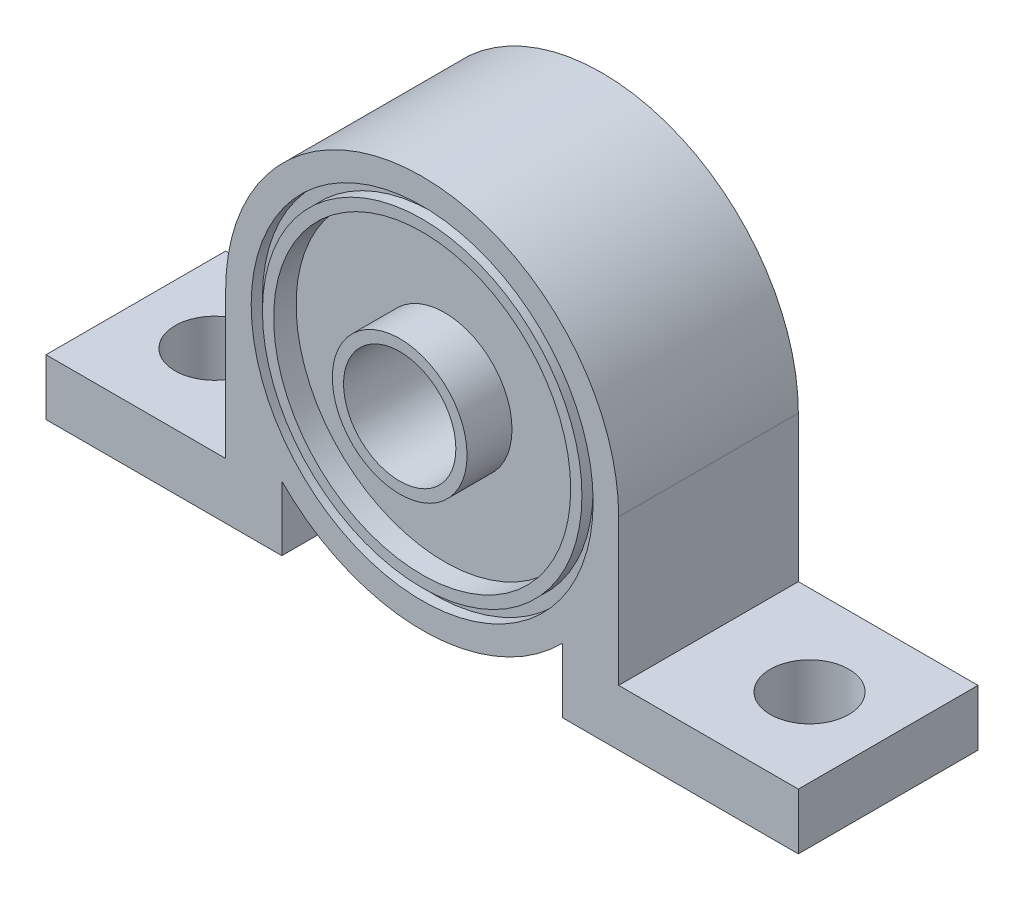
ISO-10303-21;
HEADER;
FILE_DESCRIPTION(('STEP AP214'),'2;1');
FILE_NAME('part.step','',(''),(''),'','','');
FILE_SCHEMA(('AUTOMOTIVE_DESIGN { 1 0 10303 214 1 1 1 1 }'));
ENDSEC;
DATA;
#1=APPLICATION_CONTEXT('core data for automotive mechanical design processes');
#2=APPLICATION_PROTOCOL_DEFINITION('international standard','automotive_design',2000,#1);
#3=PRODUCT_CONTEXT('',#1,'mechanical');
#4=PRODUCT('Part','Part','',(#3));
#5=PRODUCT_RELATED_PRODUCT_CATEGORY('part','',(#4));
#6=PRODUCT_DEFINITION_FORMATION('','',#4);
#7=PRODUCT_DEFINITION_CONTEXT('part definition',#1,'design');
#8=PRODUCT_DEFINITION('design','',#6,#7);
#9=PRODUCT_DEFINITION_SHAPE('','',#8);
#10=(LENGTH_UNIT() NAMED_UNIT(*) SI_UNIT(.MILLI.,.METRE.));
#11=(NAMED_UNIT(*) PLANE_ANGLE_UNIT() SI_UNIT($,.RADIAN.));
#12=(NAMED_UNIT(*) SI_UNIT($,.STERADIAN.) SOLID_ANGLE_UNIT());
#13=UNCERTAINTY_MEASURE_WITH_UNIT(LENGTH_MEASURE(1.E-05),#10,'distance_accuracy_value','');
#14=(GEOMETRIC_REPRESENTATION_CONTEXT(3) GLOBAL_UNCERTAINTY_ASSIGNED_CONTEXT((#13)) GLOBAL_UNIT_ASSIGNED_CONTEXT((#10,
#11,#12)) REPRESENTATION_CONTEXT('',''));
#15=CARTESIAN_POINT('',(0.,0.,0.));
#16=DIRECTION('',(0.,0.,1.));
#17=DIRECTION('',(1.,0.,0.));
#18=AXIS2_PLACEMENT_3D('',#15,#16,#17);
#19=CARTESIAN_POINT('',(0.,0.,16.));
#20=DIRECTION('',(0.,0.,1.));
#21=DIRECTION('',(1.,0.,0.));
#22=AXIS2_PLACEMENT_3D('',#19,#20,#21);
#23=PLANE('',#22);
#24=CARTESIAN_POINT('',(0.,0.,16.));
#25=DIRECTION('',(0.,0.,1.));
#26=DIRECTION('',(1.,0.,0.));
#27=AXIS2_PLACEMENT_3D('',#24,#25,#26);
#28=CIRCLE('',#27,13.2270891764255);
#29=CARTESIAN_POINT('',(13.2270891764255,0.,16.));
#30=VERTEX_POINT('',#29);
#31=EDGE_CURVE('E308',#30,#30,#28,.T.);
#32=ORIENTED_EDGE('',*,*,#31,.F.);
#33=EDGE_LOOP('',(#32));
#34=FACE_BOUND('',#33,.T.);
#35=CARTESIAN_POINT('',(0.,0.,16.));
#36=DIRECTION('',(0.,0.,1.));
#37=DIRECTION('',(1.,0.,0.));
#38=AXIS2_PLACEMENT_3D('',#35,#36,#37);
#39=CIRCLE('',#38,14.2270891764255);
#40=CARTESIAN_POINT('',(14.2270891764255,0.,16.));
#41=VERTEX_POINT('',#40);
#42=EDGE_CURVE('E290',#41,#41,#39,.T.);
#43=ORIENTED_EDGE('',*,*,#42,.T.);
#44=EDGE_LOOP('',(#43));
#45=FACE_BOUND('',#44,.T.);
#46=ADVANCED_FACE('F37',(#34,#45),#23,.T.);
#47=CARTESIAN_POINT('',(0.,0.,0.));
#48=DIRECTION('',(0.,0.,1.));
#49=DIRECTION('',(1.,0.,0.));
#50=AXIS2_PLACEMENT_3D('',#47,#48,#49);
#51=PLANE('',#50);
#52=CARTESIAN_POINT('',(0.,0.,0.));
#53=DIRECTION('',(0.,0.,1.));
#54=DIRECTION('',(1.,0.,0.));
#55=AXIS2_PLACEMENT_3D('',#52,#53,#54);
#56=CIRCLE('',#55,5.);
#57=CARTESIAN_POINT('',(5.,0.,0.));
#58=VERTEX_POINT('',#57);
#59=EDGE_CURVE('E163',#58,#58,#56,.T.);
#60=ORIENTED_EDGE('',*,*,#59,.T.);
#61=EDGE_LOOP('',(#60));
#62=FACE_BOUND('',#61,.T.);
#63=CARTESIAN_POINT('',(0.,0.,0.));
#64=DIRECTION('',(0.,0.,-1.));
#65=DIRECTION('',(-1.,0.,0.));
#66=AXIS2_PLACEMENT_3D('',#63,#64,#65);
#67=CIRCLE('',#66,6.);
#68=CARTESIAN_POINT('',(-6.,0.,0.));
#69=VERTEX_POINT('',#68);
#70=EDGE_CURVE('E287',#69,#69,#67,.T.);
#71=ORIENTED_EDGE('',*,*,#70,.T.);
#72=EDGE_LOOP('',(#71));
#73=FACE_BOUND('',#72,.T.);
#74=ADVANCED_FACE('F264',(#62,#73),#51,.F.);
#75=CARTESIAN_POINT('',(0.,0.,16.));
#76=DIRECTION('',(0.,0.,1.));
#77=DIRECTION('',(1.,0.,0.));
#78=AXIS2_PLACEMENT_3D('',#75,#76,#77);
#79=CIRCLE('',#78,15.2270891764255);
#80=CARTESIAN_POINT('',(15.2270891764255,0.,16.));
#81=VERTEX_POINT('',#80);
#82=EDGE_CURVE('E281',#81,#81,#79,.T.);
#83=ORIENTED_EDGE('',*,*,#82,.F.);
#84=EDGE_LOOP('',(#83));
#85=FACE_BOUND('',#84,.T.);
#86=DIRECTION('',(1.,0.,0.));
#87=VECTOR('',#86,1.);
#88=CARTESIAN_POINT('',(12.5,-18.,16.));
#89=LINE('',#88,#87);
#90=CARTESIAN_POINT('',(12.5,-18.,16.));
#91=VERTEX_POINT('',#90);
#92=CARTESIAN_POINT('',(33.5,-18.,16.));
#93=VERTEX_POINT('',#92);
#94=EDGE_CURVE('E182',#91,#93,#89,.T.);
#95=ORIENTED_EDGE('',*,*,#94,.T.);
#96=DIRECTION('',(0.,1.,0.));
#97=VECTOR('',#96,1.);
#98=CARTESIAN_POINT('',(33.5,-18.,16.));
#99=LINE('',#98,#97);
#100=CARTESIAN_POINT('',(33.5,-13.,16.));
#101=VERTEX_POINT('',#100);
#102=EDGE_CURVE('E110',#93,#101,#99,.T.);
#103=ORIENTED_EDGE('',*,*,#102,.T.);
#104=DIRECTION('',(-1.,0.,0.));
#105=VECTOR('',#104,1.);
#106=CARTESIAN_POINT('',(33.5,-13.,16.));
#107=LINE('',#106,#105);
#108=CARTESIAN_POINT('',(17.5,-13.,16.));
#109=VERTEX_POINT('',#108);
#110=EDGE_CURVE('E210',#101,#109,#107,.T.);
#111=ORIENTED_EDGE('',*,*,#110,.T.);
#112=DIRECTION('',(0.,1.,0.));
#113=VECTOR('',#112,1.);
#114=CARTESIAN_POINT('',(17.5,-13.,16.));
#115=LINE('',#114,#113);
#116=CARTESIAN_POINT('',(17.5,0.,16.));
#117=VERTEX_POINT('',#116);
#118=EDGE_CURVE('E228',#109,#117,#115,.T.);
#119=ORIENTED_EDGE('',*,*,#118,.T.);
#120=CARTESIAN_POINT('',(0.,0.,16.));
#121=DIRECTION('',(0.,0.,1.));
#122=DIRECTION('',(1.,0.,0.));
#123=AXIS2_PLACEMENT_3D('',#120,#121,#122);
#124=CIRCLE('',#123,17.5);
#125=CARTESIAN_POINT('',(-17.5,0.,16.));
#126=VERTEX_POINT('',#125);
#127=EDGE_CURVE('E225',#117,#126,#124,.T.);
#128=ORIENTED_EDGE('',*,*,#127,.T.);
#129=DIRECTION('',(0.,-1.,0.));
#130=VECTOR('',#129,1.);
#131=CARTESIAN_POINT('',(-17.5,-13.,16.));
#132=LINE('',#131,#130);
#133=CARTESIAN_POINT('',(-17.5,-13.,16.));
#134=VERTEX_POINT('',#133);
#135=EDGE_CURVE('E227',#126,#134,#132,.T.);
#136=ORIENTED_EDGE('',*,*,#135,.T.);
#137=DIRECTION('',(-1.,0.,0.));
#138=VECTOR('',#137,1.);
#139=CARTESIAN_POINT('',(-33.5,-13.,16.));
#140=LINE('',#139,#138);
#141=CARTESIAN_POINT('',(-33.5,-13.,16.));
#142=VERTEX_POINT('',#141);
#143=EDGE_CURVE('E230',#134,#142,#140,.T.);
#144=ORIENTED_EDGE('',*,*,#143,.T.);
#145=DIRECTION('',(0.,-1.,0.));
#146=VECTOR('',#145,1.);
#147=CARTESIAN_POINT('',(-33.5,-18.,16.));
#148=LINE('',#147,#146);
#149=CARTESIAN_POINT('',(-33.5,-18.,16.));
#150=VERTEX_POINT('',#149);
#151=EDGE_CURVE('E236',#142,#150,#148,.T.);
#152=ORIENTED_EDGE('',*,*,#151,.T.);
#153=DIRECTION('',(1.,0.,0.));
#154=VECTOR('',#153,1.);
#155=CARTESIAN_POINT('',(-12.5,-18.,16.));
#156=LINE('',#155,#154);
#157=CARTESIAN_POINT('',(-12.5,-18.,16.));
#158=VERTEX_POINT('',#157);
#159=EDGE_CURVE('E141',#150,#158,#156,.T.);
#160=ORIENTED_EDGE('',*,*,#159,.T.);
#161=DIRECTION('',(0.,1.,0.));
#162=VECTOR('',#161,1.);
#163=CARTESIAN_POINT('',(-12.5,-18.,16.));
#164=LINE('',#163,#162);
#165=CARTESIAN_POINT('',(-12.5,-12.2474487139159,16.));
#166=VERTEX_POINT('',#165);
#167=EDGE_CURVE('E135',#158,#166,#164,.T.);
#168=ORIENTED_EDGE('',*,*,#167,.T.);
#169=CARTESIAN_POINT('',(0.,0.,16.));
#170=DIRECTION('',(0.,0.,1.));
#171=DIRECTION('',(1.,0.,0.));
#172=AXIS2_PLACEMENT_3D('',#169,#170,#171);
#173=CIRCLE('',#172,17.5);
#174=CARTESIAN_POINT('',(12.5,-12.2474487139159,16.));
#175=VERTEX_POINT('',#174);
#176=EDGE_CURVE('E139',#166,#175,#173,.T.);
#177=ORIENTED_EDGE('',*,*,#176,.T.);
#178=DIRECTION('',(0.,-1.,0.));
#179=VECTOR('',#178,1.);
#180=CARTESIAN_POINT('',(12.5,-18.,16.));
#181=LINE('',#180,#179);
#182=EDGE_CURVE('E55',#175,#91,#181,.T.);
#183=ORIENTED_EDGE('',*,*,#182,.T.);
#184=EDGE_LOOP('',(#95,#103,#111,#119,#128,#136,#144,#152,#160,#168,#177,#183));
#185=FACE_BOUND('',#184,.T.);
#186=ADVANCED_FACE('F137',(#85,#185),#23,.T.);
#187=CARTESIAN_POINT('',(0.,0.,0.));
#188=DIRECTION('',(0.,0.,-1.));
#189=DIRECTION('',(-1.,0.,0.));
#190=AXIS2_PLACEMENT_3D('',#187,#188,#189);
#191=CIRCLE('',#190,13.402399482386);
#192=CARTESIAN_POINT('',(-13.402399482386,0.,0.));
#193=VERTEX_POINT('',#192);
#194=EDGE_CURVE('E297',#193,#193,#191,.T.);
#195=ORIENTED_EDGE('',*,*,#194,.F.);
#196=EDGE_LOOP('',(#195));
#197=FACE_BOUND('',#196,.T.);
#198=DIRECTION('',(1.,0.,0.));
#199=VECTOR('',#198,1.);
#200=CARTESIAN_POINT('',(12.5,-18.,0.));
#201=LINE('',#200,#199);
#202=CARTESIAN_POINT('',(12.5,-18.,0.));
#203=VERTEX_POINT('',#202);
#204=CARTESIAN_POINT('',(33.5,-18.,0.));
#205=VERTEX_POINT('',#204);
#206=EDGE_CURVE('E159',#203,#205,#201,.T.);
#207=ORIENTED_EDGE('',*,*,#206,.F.);
#208=DIRECTION('',(0.,-1.,0.));
#209=VECTOR('',#208,1.);
#210=CARTESIAN_POINT('',(12.5,-18.,0.));
#211=LINE('',#210,#209);
#212=CARTESIAN_POINT('',(12.5,-12.2474487139159,0.));
#213=VERTEX_POINT('',#212);
#214=EDGE_CURVE('E102',#213,#203,#211,.T.);
#215=ORIENTED_EDGE('',*,*,#214,.F.);
#216=CARTESIAN_POINT('',(0.,0.,0.));
#217=DIRECTION('',(0.,0.,1.));
#218=DIRECTION('',(1.,0.,0.));
#219=AXIS2_PLACEMENT_3D('',#216,#217,#218);
#220=CIRCLE('',#219,17.5);
#221=CARTESIAN_POINT('',(-12.5,-12.2474487139159,0.));
#222=VERTEX_POINT('',#221);
#223=EDGE_CURVE('E96',#222,#213,#220,.T.);
#224=ORIENTED_EDGE('',*,*,#223,.F.);
#225=DIRECTION('',(0.,1.,0.));
#226=VECTOR('',#225,1.);
#227=CARTESIAN_POINT('',(-12.5,-18.,0.));
#228=LINE('',#227,#226);
#229=CARTESIAN_POINT('',(-12.5,-18.,0.));
#230=VERTEX_POINT('',#229);
#231=EDGE_CURVE('E149',#230,#222,#228,.T.);
#232=ORIENTED_EDGE('',*,*,#231,.F.);
#233=DIRECTION('',(1.,0.,0.));
#234=VECTOR('',#233,1.);
#235=CARTESIAN_POINT('',(-12.5,-18.,0.));
#236=LINE('',#235,#234);
#237=CARTESIAN_POINT('',(-33.5,-18.,0.));
#238=VERTEX_POINT('',#237);
#239=EDGE_CURVE('E177',#238,#230,#236,.T.);
#240=ORIENTED_EDGE('',*,*,#239,.F.);
#241=DIRECTION('',(0.,-1.,0.));
#242=VECTOR('',#241,1.);
#243=CARTESIAN_POINT('',(-33.5,-18.,0.));
#244=LINE('',#243,#242);
#245=CARTESIAN_POINT('',(-33.5,-13.,0.));
#246=VERTEX_POINT('',#245);
#247=EDGE_CURVE('E175',#246,#238,#244,.T.);
#248=ORIENTED_EDGE('',*,*,#247,.F.);
#249=DIRECTION('',(-1.,0.,0.));
#250=VECTOR('',#249,1.);
#251=CARTESIAN_POINT('',(-33.5,-13.,0.));
#252=LINE('',#251,#250);
#253=CARTESIAN_POINT('',(-17.5,-13.,0.));
#254=VERTEX_POINT('',#253);
#255=EDGE_CURVE('E173',#254,#246,#252,.T.);
#256=ORIENTED_EDGE('',*,*,#255,.F.);
#257=DIRECTION('',(0.,-1.,0.));
#258=VECTOR('',#257,1.);
#259=CARTESIAN_POINT('',(-17.5,-13.,0.));
#260=LINE('',#259,#258);
#261=CARTESIAN_POINT('',(-17.5,0.,0.));
#262=VERTEX_POINT('',#261);
#263=EDGE_CURVE('E171',#262,#254,#260,.T.);
#264=ORIENTED_EDGE('',*,*,#263,.F.);
#265=CARTESIAN_POINT('',(0.,0.,0.));
#266=DIRECTION('',(0.,0.,1.));
#267=DIRECTION('',(1.,0.,0.));
#268=AXIS2_PLACEMENT_3D('',#265,#266,#267);
#269=CIRCLE('',#268,17.5);
#270=CARTESIAN_POINT('',(17.5,0.,0.));
#271=VERTEX_POINT('',#270);
#272=EDGE_CURVE('E169',#271,#262,#269,.T.);
#273=ORIENTED_EDGE('',*,*,#272,.F.);
#274=DIRECTION('',(0.,1.,0.));
#275=VECTOR('',#274,1.);
#276=CARTESIAN_POINT('',(17.5,-13.,0.));
#277=LINE('',#276,#275);
#278=CARTESIAN_POINT('',(17.5,-13.,0.));
#279=VERTEX_POINT('',#278);
#280=EDGE_CURVE('E167',#279,#271,#277,.T.);
#281=ORIENTED_EDGE('',*,*,#280,.F.);
#282=DIRECTION('',(-1.,0.,0.));
#283=VECTOR('',#282,1.);
#284=CARTESIAN_POINT('',(33.5,-13.,0.));
#285=LINE('',#284,#283);
#286=CARTESIAN_POINT('',(33.5,-13.,0.));
#287=VERTEX_POINT('',#286);
#288=EDGE_CURVE('E165',#287,#279,#285,.T.);
#289=ORIENTED_EDGE('',*,*,#288,.F.);
#290=DIRECTION('',(0.,1.,0.));
#291=VECTOR('',#290,1.);
#292=CARTESIAN_POINT('',(33.5,-18.,0.));
#293=LINE('',#292,#291);
#294=EDGE_CURVE('E162',#205,#287,#293,.T.);
#295=ORIENTED_EDGE('',*,*,#294,.F.);
#296=EDGE_LOOP('',(#207,#215,#224,#232,#240,#248,#256,#264,#273,#281,#289,#295));
#297=FACE_BOUND('',#296,.T.);
#298=ADVANCED_FACE('F214',(#197,#297),#51,.F.);
#299=CARTESIAN_POINT('',(12.5,-18.,16.));
#300=DIRECTION('',(0.,1.,0.));
#301=DIRECTION('',(-1.,0.,0.));
#302=AXIS2_PLACEMENT_3D('',#299,#300,#301);
#303=PLANE('',#302);
#304=CARTESIAN_POINT('',(26.5,-18.,8.));
#305=DIRECTION('',(0.,-1.,0.));
#306=DIRECTION('',(1.,0.,0.));
#307=AXIS2_PLACEMENT_3D('',#304,#305,#306);
#308=CIRCLE('',#307,3.5);
#309=CARTESIAN_POINT('',(30.,-18.,8.));
#310=VERTEX_POINT('',#309);
#311=EDGE_CURVE('E382',#310,#310,#308,.T.);
#312=ORIENTED_EDGE('',*,*,#311,.F.);
#313=EDGE_LOOP('',(#312));
#314=FACE_BOUND('',#313,.T.);
#315=ORIENTED_EDGE('',*,*,#206,.T.);
#316=DIRECTION('',(0.,0.,-1.));
#317=VECTOR('',#316,1.);
#318=CARTESIAN_POINT('',(33.5,-18.,16.));
#319=LINE('',#318,#317);
#320=EDGE_CURVE('E11',#93,#205,#319,.T.);
#321=ORIENTED_EDGE('',*,*,#320,.F.);
#322=ORIENTED_EDGE('',*,*,#94,.F.);
#323=DIRECTION('',(0.,0.,-1.));
#324=VECTOR('',#323,1.);
#325=CARTESIAN_POINT('',(12.5,-18.,16.));
#326=LINE('',#325,#324);
#327=EDGE_CURVE('E155',#91,#203,#326,.T.);
#328=ORIENTED_EDGE('',*,*,#327,.T.);
#329=EDGE_LOOP('',(#315,#321,#322,#328));
#330=FACE_BOUND('',#329,.T.);
#331=ADVANCED_FACE('F39',(#314,#330),#303,.F.);
#332=CARTESIAN_POINT('',(33.5,-18.,16.));
#333=DIRECTION('',(-1.,0.,0.));
#334=DIRECTION('',(0.,-1.,0.));
#335=AXIS2_PLACEMENT_3D('',#332,#333,#334);
#336=PLANE('',#335);
#337=ORIENTED_EDGE('',*,*,#294,.T.);
#338=DIRECTION('',(0.,0.,-1.));
#339=VECTOR('',#338,1.);
#340=CARTESIAN_POINT('',(33.5,-13.,16.));
#341=LINE('',#340,#339);
#342=EDGE_CURVE('E47',#101,#287,#341,.T.);
#343=ORIENTED_EDGE('',*,*,#342,.F.);
#344=ORIENTED_EDGE('',*,*,#102,.F.);
#345=ORIENTED_EDGE('',*,*,#320,.T.);
#346=EDGE_LOOP('',(#337,#343,#344,#345));
#347=FACE_BOUND('',#346,.T.);
#348=ADVANCED_FACE('F421',(#347),#336,.F.);
#349=CARTESIAN_POINT('',(33.5,-13.,16.));
#350=DIRECTION('',(0.,-1.,0.));
#351=DIRECTION('',(1.,0.,0.));
#352=AXIS2_PLACEMENT_3D('',#349,#350,#351);
#353=PLANE('',#352);
#354=CARTESIAN_POINT('',(26.5,-13.,8.));
#355=DIRECTION('',(0.,-1.,0.));
#356=DIRECTION('',(1.,0.,0.));
#357=AXIS2_PLACEMENT_3D('',#354,#355,#356);
#358=CIRCLE('',#357,3.5);
#359=CARTESIAN_POINT('',(30.,-13.,8.));
#360=VERTEX_POINT('',#359);
#361=EDGE_CURVE('E41',#360,#360,#358,.T.);
#362=ORIENTED_EDGE('',*,*,#361,.T.);
#363=EDGE_LOOP('',(#362));
#364=FACE_BOUND('',#363,.T.);
#365=ORIENTED_EDGE('',*,*,#288,.T.);
#366=DIRECTION('',(0.,0.,-1.));
#367=VECTOR('',#366,1.);
#368=CARTESIAN_POINT('',(17.5,-13.,16.));
#369=LINE('',#368,#367);
#370=EDGE_CURVE('E201',#109,#279,#369,.T.);
#371=ORIENTED_EDGE('',*,*,#370,.F.);
#372=ORIENTED_EDGE('',*,*,#110,.F.);
#373=ORIENTED_EDGE('',*,*,#342,.T.);
#374=EDGE_LOOP('',(#365,#371,#372,#373));
#375=FACE_BOUND('',#374,.T.);
#376=ADVANCED_FACE('F208',(#364,#375),#353,.F.);
#377=CARTESIAN_POINT('',(17.5,-13.,16.));
#378=DIRECTION('',(-1.,0.,0.));
#379=DIRECTION('',(0.,0.,1.));
#380=AXIS2_PLACEMENT_3D('',#377,#378,#379);
#381=PLANE('',#380);
#382=ORIENTED_EDGE('',*,*,#280,.T.);
#383=DIRECTION('',(0.,0.,-1.));
#384=VECTOR('',#383,1.);
#385=CARTESIAN_POINT('',(17.5,0.,16.));
#386=LINE('',#385,#384);
#387=EDGE_CURVE('E198',#117,#271,#386,.T.);
#388=ORIENTED_EDGE('',*,*,#387,.F.);
#389=ORIENTED_EDGE('',*,*,#118,.F.);
#390=ORIENTED_EDGE('',*,*,#370,.T.);
#391=EDGE_LOOP('',(#382,#388,#389,#390));
#392=FACE_BOUND('',#391,.T.);
#393=ADVANCED_FACE('F219',(#392),#381,.F.);
#394=CARTESIAN_POINT('',(0.,0.,16.));
#395=DIRECTION('',(0.,0.,-1.));
#396=DIRECTION('',(-1.,0.,0.));
#397=AXIS2_PLACEMENT_3D('',#394,#395,#396);
#398=CYLINDRICAL_SURFACE('',#397,17.5);
#399=ORIENTED_EDGE('',*,*,#272,.T.);
#400=DIRECTION('',(0.,0.,-1.));
#401=VECTOR('',#400,1.);
#402=CARTESIAN_POINT('',(-17.5,0.,16.));
#403=LINE('',#402,#401);
#404=EDGE_CURVE('E195',#126,#262,#403,.T.);
#405=ORIENTED_EDGE('',*,*,#404,.F.);
#406=ORIENTED_EDGE('',*,*,#127,.F.);
#407=ORIENTED_EDGE('',*,*,#387,.T.);
#408=EDGE_LOOP('',(#399,#405,#406,#407));
#409=FACE_BOUND('',#408,.T.);
#410=ADVANCED_FACE('F223',(#409),#398,.T.);
#411=CARTESIAN_POINT('',(-17.5,-13.,16.));
#412=DIRECTION('',(1.,0.,0.));
#413=DIRECTION('',(0.,0.,-1.));
#414=AXIS2_PLACEMENT_3D('',#411,#412,#413);
#415=PLANE('',#414);
#416=ORIENTED_EDGE('',*,*,#263,.T.);
#417=DIRECTION('',(0.,0.,-1.));
#418=VECTOR('',#417,1.);
#419=CARTESIAN_POINT('',(-17.5,-13.,16.));
#420=LINE('',#419,#418);
#421=EDGE_CURVE('E192',#134,#254,#420,.T.);
#422=ORIENTED_EDGE('',*,*,#421,.F.);
#423=ORIENTED_EDGE('',*,*,#135,.F.);
#424=ORIENTED_EDGE('',*,*,#404,.T.);
#425=EDGE_LOOP('',(#416,#422,#423,#424));
#426=FACE_BOUND('',#425,.T.);
#427=ADVANCED_FACE('F412',(#426),#415,.F.);
#428=CARTESIAN_POINT('',(-33.5,-13.,16.));
#429=DIRECTION('',(0.,-1.,0.));
#430=DIRECTION('',(0.,0.,-1.));
#431=AXIS2_PLACEMENT_3D('',#428,#429,#430);
#432=PLANE('',#431);
#433=CARTESIAN_POINT('',(-26.5,-13.,7.99999999999999));
#434=DIRECTION('',(0.,-1.,0.));
#435=DIRECTION('',(0.,0.,-1.));
#436=AXIS2_PLACEMENT_3D('',#433,#434,#435);
#437=CIRCLE('',#436,3.5);
#438=CARTESIAN_POINT('',(-26.5,-13.,4.49999999999999));
#439=VERTEX_POINT('',#438);
#440=EDGE_CURVE('E386',#439,#439,#437,.T.);
#441=ORIENTED_EDGE('',*,*,#440,.T.);
#442=EDGE_LOOP('',(#441));
#443=FACE_BOUND('',#442,.T.);
#444=ORIENTED_EDGE('',*,*,#255,.T.);
#445=DIRECTION('',(0.,0.,-1.));
#446=VECTOR('',#445,1.);
#447=CARTESIAN_POINT('',(-33.5,-13.,16.));
#448=LINE('',#447,#446);
#449=EDGE_CURVE('E189',#142,#246,#448,.T.);
#450=ORIENTED_EDGE('',*,*,#449,.F.);
#451=ORIENTED_EDGE('',*,*,#143,.F.);
#452=ORIENTED_EDGE('',*,*,#421,.T.);
#453=EDGE_LOOP('',(#444,#450,#451,#452));
#454=FACE_BOUND('',#453,.T.);
#455=ADVANCED_FACE('F408',(#443,#454),#432,.F.);
#456=CARTESIAN_POINT('',(-33.5,-18.,16.));
#457=DIRECTION('',(1.,0.,0.));
#458=DIRECTION('',(0.,1.,0.));
#459=AXIS2_PLACEMENT_3D('',#456,#457,#458);
#460=PLANE('',#459);
#461=ORIENTED_EDGE('',*,*,#247,.T.);
#462=DIRECTION('',(0.,0.,-1.));
#463=VECTOR('',#462,1.);
#464=CARTESIAN_POINT('',(-33.5,-18.,16.));
#465=LINE('',#464,#463);
#466=EDGE_CURVE('E186',#150,#238,#465,.T.);
#467=ORIENTED_EDGE('',*,*,#466,.F.);
#468=ORIENTED_EDGE('',*,*,#151,.F.);
#469=ORIENTED_EDGE('',*,*,#449,.T.);
#470=EDGE_LOOP('',(#461,#467,#468,#469));
#471=FACE_BOUND('',#470,.T.);
#472=ADVANCED_FACE('F242',(#471),#460,.F.);
#473=CARTESIAN_POINT('',(-12.5,-18.,16.));
#474=DIRECTION('',(0.,1.,0.));
#475=DIRECTION('',(0.,0.,1.));
#476=AXIS2_PLACEMENT_3D('',#473,#474,#475);
#477=PLANE('',#476);
#478=CARTESIAN_POINT('',(-26.5,-18.,7.99999999999999));
#479=DIRECTION('',(0.,-1.,0.));
#480=DIRECTION('',(-1.,0.,0.));
#481=AXIS2_PLACEMENT_3D('',#478,#479,#480);
#482=CIRCLE('',#481,3.5);
#483=CARTESIAN_POINT('',(-30.,-18.,7.99999999999999));
#484=VERTEX_POINT('',#483);
#485=EDGE_CURVE('E392',#484,#484,#482,.T.);
#486=ORIENTED_EDGE('',*,*,#485,.F.);
#487=EDGE_LOOP('',(#486));
#488=FACE_BOUND('',#487,.T.);
#489=ORIENTED_EDGE('',*,*,#239,.T.);
#490=DIRECTION('',(0.,0.,-1.));
#491=VECTOR('',#490,1.);
#492=CARTESIAN_POINT('',(-12.5,-18.,16.));
#493=LINE('',#492,#491);
#494=EDGE_CURVE('E150',#158,#230,#493,.T.);
#495=ORIENTED_EDGE('',*,*,#494,.F.);
#496=ORIENTED_EDGE('',*,*,#159,.F.);
#497=ORIENTED_EDGE('',*,*,#466,.T.);
#498=EDGE_LOOP('',(#489,#495,#496,#497));
#499=FACE_BOUND('',#498,.T.);
#500=ADVANCED_FACE('F246',(#488,#499),#477,.F.);
#501=CARTESIAN_POINT('',(-12.5,-18.,16.));
#502=DIRECTION('',(-1.,0.,0.));
#503=DIRECTION('',(0.,0.,1.));
#504=AXIS2_PLACEMENT_3D('',#501,#502,#503);
#505=PLANE('',#504);
#506=ORIENTED_EDGE('',*,*,#231,.T.);
#507=DIRECTION('',(0.,0.,-1.));
#508=VECTOR('',#507,1.);
#509=CARTESIAN_POINT('',(-12.5,-12.2474487139159,16.));
#510=LINE('',#509,#508);
#511=EDGE_CURVE('E146',#166,#222,#510,.T.);
#512=ORIENTED_EDGE('',*,*,#511,.F.);
#513=ORIENTED_EDGE('',*,*,#167,.F.);
#514=ORIENTED_EDGE('',*,*,#494,.T.);
#515=EDGE_LOOP('',(#506,#512,#513,#514));
#516=FACE_BOUND('',#515,.T.);
#517=ADVANCED_FACE('F147',(#516),#505,.F.);
#518=CARTESIAN_POINT('',(0.,0.,16.));
#519=DIRECTION('',(0.,0.,-1.));
#520=DIRECTION('',(-1.,0.,0.));
#521=AXIS2_PLACEMENT_3D('',#518,#519,#520);
#522=CYLINDRICAL_SURFACE('',#521,17.5);
#523=ORIENTED_EDGE('',*,*,#223,.T.);
#524=DIRECTION('',(0.,0.,-1.));
#525=VECTOR('',#524,1.);
#526=CARTESIAN_POINT('',(12.5,-12.2474487139159,16.));
#527=LINE('',#526,#525);
#528=EDGE_CURVE('E151',#175,#213,#527,.T.);
#529=ORIENTED_EDGE('',*,*,#528,.F.);
#530=ORIENTED_EDGE('',*,*,#176,.F.);
#531=ORIENTED_EDGE('',*,*,#511,.T.);
#532=EDGE_LOOP('',(#523,#529,#530,#531));
#533=FACE_BOUND('',#532,.T.);
#534=ADVANCED_FACE('F153',(#533),#522,.T.);
#535=CARTESIAN_POINT('',(12.5,-18.,16.));
#536=DIRECTION('',(1.,0.,0.));
#537=DIRECTION('',(0.,1.,0.));
#538=AXIS2_PLACEMENT_3D('',#535,#536,#537);
#539=PLANE('',#538);
#540=ORIENTED_EDGE('',*,*,#214,.T.);
#541=ORIENTED_EDGE('',*,*,#327,.F.);
#542=ORIENTED_EDGE('',*,*,#182,.F.);
#543=ORIENTED_EDGE('',*,*,#528,.T.);
#544=EDGE_LOOP('',(#540,#541,#542,#543));
#545=FACE_BOUND('',#544,.T.);
#546=ADVANCED_FACE('F250',(#545),#539,.F.);
#547=CARTESIAN_POINT('',(0.,0.,16.));
#548=DIRECTION('',(0.,0.,-1.));
#549=DIRECTION('',(-1.,0.,0.));
#550=AXIS2_PLACEMENT_3D('',#547,#548,#549);
#551=CYLINDRICAL_SURFACE('',#550,5.);
#552=ORIENTED_EDGE('',*,*,#59,.F.);
#553=EDGE_LOOP('',(#552));
#554=FACE_BOUND('',#553,.T.);
#555=CARTESIAN_POINT('',(0.,0.,18.));
#556=DIRECTION('',(0.,0.,1.));
#557=DIRECTION('',(1.,0.,0.));
#558=AXIS2_PLACEMENT_3D('',#555,#556,#557);
#559=CIRCLE('',#558,5.);
#560=CARTESIAN_POINT('',(5.,0.,18.));
#561=VERTEX_POINT('',#560);
#562=EDGE_CURVE('E312',#561,#561,#559,.T.);
#563=ORIENTED_EDGE('',*,*,#562,.T.);
#564=EDGE_LOOP('',(#563));
#565=FACE_BOUND('',#564,.T.);
#566=ADVANCED_FACE('F252',(#554,#565),#551,.F.);
#567=CARTESIAN_POINT('',(0.,0.,18.));
#568=DIRECTION('',(0.,0.,1.));
#569=DIRECTION('',(1.,0.,0.));
#570=AXIS2_PLACEMENT_3D('',#567,#568,#569);
#571=PLANE('',#570);
#572=CARTESIAN_POINT('',(0.,0.,18.));
#573=DIRECTION('',(0.,0.,1.));
#574=DIRECTION('',(1.,0.,0.));
#575=AXIS2_PLACEMENT_3D('',#572,#573,#574);
#576=CIRCLE('',#575,6.);
#577=CARTESIAN_POINT('',(6.,0.,18.));
#578=VERTEX_POINT('',#577);
#579=EDGE_CURVE('E317',#578,#578,#576,.T.);
#580=ORIENTED_EDGE('',*,*,#579,.T.);
#581=EDGE_LOOP('',(#580));
#582=FACE_BOUND('',#581,.T.);
#583=ORIENTED_EDGE('',*,*,#562,.F.);
#584=EDGE_LOOP('',(#583));
#585=FACE_BOUND('',#584,.T.);
#586=ADVANCED_FACE('F258',(#582,#585),#571,.T.);
#587=CARTESIAN_POINT('',(0.,0.,18.));
#588=DIRECTION('',(0.,0.,-1.));
#589=DIRECTION('',(-1.,0.,0.));
#590=AXIS2_PLACEMENT_3D('',#587,#588,#589);
#591=CYLINDRICAL_SURFACE('',#590,6.);
#592=ORIENTED_EDGE('',*,*,#579,.F.);
#593=EDGE_LOOP('',(#592));
#594=FACE_BOUND('',#593,.T.);
#595=CARTESIAN_POINT('',(0.,0.,14.));
#596=DIRECTION('',(0.,0.,1.));
#597=DIRECTION('',(1.,0.,0.));
#598=AXIS2_PLACEMENT_3D('',#595,#596,#597);
#599=CIRCLE('',#598,6.);
#600=CARTESIAN_POINT('',(6.,0.,14.));
#601=VERTEX_POINT('',#600);
#602=EDGE_CURVE('E303',#601,#601,#599,.T.);
#603=ORIENTED_EDGE('',*,*,#602,.T.);
#604=EDGE_LOOP('',(#603));
#605=FACE_BOUND('',#604,.T.);
#606=ADVANCED_FACE('F329',(#594,#605),#591,.T.);
#607=CARTESIAN_POINT('',(0.,0.,14.));
#608=DIRECTION('',(0.,0.,1.));
#609=DIRECTION('',(1.,0.,0.));
#610=AXIS2_PLACEMENT_3D('',#607,#608,#609);
#611=CYLINDRICAL_SURFACE('',#610,13.2270891764255);
#612=CARTESIAN_POINT('',(0.,0.,14.));
#613=DIRECTION('',(0.,0.,1.));
#614=DIRECTION('',(1.,0.,0.));
#615=AXIS2_PLACEMENT_3D('',#612,#613,#614);
#616=CIRCLE('',#615,13.2270891764255);
#617=CARTESIAN_POINT('',(13.2270891764255,0.,14.));
#618=VERTEX_POINT('',#617);
#619=EDGE_CURVE('E309',#618,#618,#616,.T.);
#620=ORIENTED_EDGE('',*,*,#619,.F.);
#621=EDGE_LOOP('',(#620));
#622=FACE_BOUND('',#621,.T.);
#623=ORIENTED_EDGE('',*,*,#31,.T.);
#624=EDGE_LOOP('',(#623));
#625=FACE_BOUND('',#624,.T.);
#626=ADVANCED_FACE('F335',(#622,#625),#611,.F.);
#627=CARTESIAN_POINT('',(0.,0.,14.));
#628=DIRECTION('',(0.,0.,1.));
#629=DIRECTION('',(1.,0.,0.));
#630=AXIS2_PLACEMENT_3D('',#627,#628,#629);
#631=PLANE('',#630);
#632=ORIENTED_EDGE('',*,*,#602,.F.);
#633=EDGE_LOOP('',(#632));
#634=FACE_BOUND('',#633,.T.);
#635=ORIENTED_EDGE('',*,*,#619,.T.);
#636=EDGE_LOOP('',(#635));
#637=FACE_BOUND('',#636,.T.);
#638=ADVANCED_FACE('F341',(#634,#637),#631,.T.);
#639=CARTESIAN_POINT('',(0.,0.,2.));
#640=DIRECTION('',(0.,0.,-1.));
#641=DIRECTION('',(-1.,0.,0.));
#642=AXIS2_PLACEMENT_3D('',#639,#640,#641);
#643=CYLINDRICAL_SURFACE('',#642,13.402399482386);
#644=CARTESIAN_POINT('',(0.,0.,2.));
#645=DIRECTION('',(0.,0.,-1.));
#646=DIRECTION('',(-1.,0.,0.));
#647=AXIS2_PLACEMENT_3D('',#644,#645,#646);
#648=CIRCLE('',#647,13.402399482386);
#649=CARTESIAN_POINT('',(-13.402399482386,0.,2.));
#650=VERTEX_POINT('',#649);
#651=EDGE_CURVE('E300',#650,#650,#648,.T.);
#652=ORIENTED_EDGE('',*,*,#651,.F.);
#653=EDGE_LOOP('',(#652));
#654=FACE_BOUND('',#653,.T.);
#655=ORIENTED_EDGE('',*,*,#194,.T.);
#656=EDGE_LOOP('',(#655));
#657=FACE_BOUND('',#656,.T.);
#658=ADVANCED_FACE('F345',(#654,#657),#643,.F.);
#659=CARTESIAN_POINT('',(0.,0.,2.));
#660=DIRECTION('',(0.,0.,-1.));
#661=DIRECTION('',(-1.,0.,0.));
#662=AXIS2_PLACEMENT_3D('',#659,#660,#661);
#663=PLANE('',#662);
#664=CARTESIAN_POINT('',(0.,0.,2.));
#665=DIRECTION('',(0.,0.,-1.));
#666=DIRECTION('',(-1.,0.,0.));
#667=AXIS2_PLACEMENT_3D('',#664,#665,#666);
#668=CIRCLE('',#667,6.);
#669=CARTESIAN_POINT('',(-6.,0.,2.));
#670=VERTEX_POINT('',#669);
#671=EDGE_CURVE('E294',#670,#670,#668,.T.);
#672=ORIENTED_EDGE('',*,*,#671,.F.);
#673=EDGE_LOOP('',(#672));
#674=FACE_BOUND('',#673,.T.);
#675=ORIENTED_EDGE('',*,*,#651,.T.);
#676=EDGE_LOOP('',(#675));
#677=FACE_BOUND('',#676,.T.);
#678=ADVANCED_FACE('F349',(#674,#677),#663,.T.);
#679=CARTESIAN_POINT('',(0.,0.,2.));
#680=DIRECTION('',(0.,0.,-1.));
#681=DIRECTION('',(-1.,0.,0.));
#682=AXIS2_PLACEMENT_3D('',#679,#680,#681);
#683=CYLINDRICAL_SURFACE('',#682,6.);
#684=ORIENTED_EDGE('',*,*,#671,.T.);
#685=EDGE_LOOP('',(#684));
#686=FACE_BOUND('',#685,.T.);
#687=ORIENTED_EDGE('',*,*,#70,.F.);
#688=EDGE_LOOP('',(#687));
#689=FACE_BOUND('',#688,.T.);
#690=ADVANCED_FACE('F353',(#686,#689),#683,.T.);
#691=CARTESIAN_POINT('',(0.,0.,15.));
#692=DIRECTION('',(0.,0.,1.));
#693=DIRECTION('',(1.,0.,0.));
#694=AXIS2_PLACEMENT_3D('',#691,#692,#693);
#695=CYLINDRICAL_SURFACE('',#694,15.2270891764255);
#696=CARTESIAN_POINT('',(0.,0.,15.));
#697=DIRECTION('',(0.,0.,1.));
#698=DIRECTION('',(1.,0.,0.));
#699=AXIS2_PLACEMENT_3D('',#696,#697,#698);
#700=CIRCLE('',#699,15.2270891764255);
#701=CARTESIAN_POINT('',(15.2270891764255,0.,15.));
#702=VERTEX_POINT('',#701);
#703=EDGE_CURVE('E283',#702,#702,#700,.T.);
#704=ORIENTED_EDGE('',*,*,#703,.F.);
#705=EDGE_LOOP('',(#704));
#706=FACE_BOUND('',#705,.T.);
#707=ORIENTED_EDGE('',*,*,#82,.T.);
#708=EDGE_LOOP('',(#707));
#709=FACE_BOUND('',#708,.T.);
#710=ADVANCED_FACE('F357',(#706,#709),#695,.F.);
#711=CARTESIAN_POINT('',(0.,0.,15.));
#712=DIRECTION('',(0.,0.,1.));
#713=DIRECTION('',(1.,0.,0.));
#714=AXIS2_PLACEMENT_3D('',#711,#712,#713);
#715=PLANE('',#714);
#716=CARTESIAN_POINT('',(0.,0.,15.));
#717=DIRECTION('',(0.,0.,1.));
#718=DIRECTION('',(1.,0.,0.));
#719=AXIS2_PLACEMENT_3D('',#716,#717,#718);
#720=CIRCLE('',#719,14.2270891764255);
#721=CARTESIAN_POINT('',(14.2270891764255,0.,15.));
#722=VERTEX_POINT('',#721);
#723=EDGE_CURVE('E284',#722,#722,#720,.T.);
#724=ORIENTED_EDGE('',*,*,#723,.F.);
#725=EDGE_LOOP('',(#724));
#726=FACE_BOUND('',#725,.T.);
#727=ORIENTED_EDGE('',*,*,#703,.T.);
#728=EDGE_LOOP('',(#727));
#729=FACE_BOUND('',#728,.T.);
#730=ADVANCED_FACE('F361',(#726,#729),#715,.T.);
#731=CARTESIAN_POINT('',(0.,0.,15.));
#732=DIRECTION('',(0.,0.,1.));
#733=DIRECTION('',(1.,0.,0.));
#734=AXIS2_PLACEMENT_3D('',#731,#732,#733);
#735=CYLINDRICAL_SURFACE('',#734,14.2270891764255);
#736=ORIENTED_EDGE('',*,*,#723,.T.);
#737=EDGE_LOOP('',(#736));
#738=FACE_BOUND('',#737,.T.);
#739=ORIENTED_EDGE('',*,*,#42,.F.);
#740=EDGE_LOOP('',(#739));
#741=FACE_BOUND('',#740,.T.);
#742=ADVANCED_FACE('F365',(#738,#741),#735,.T.);
#743=CARTESIAN_POINT('',(-26.5,-7.99999999999999,7.99999999999999));
#744=DIRECTION('',(0.,-1.,0.));
#745=DIRECTION('',(1.,0.,0.));
#746=AXIS2_PLACEMENT_3D('',#743,#744,#745);
#747=CYLINDRICAL_SURFACE('',#746,3.5);
#748=ORIENTED_EDGE('',*,*,#485,.T.);
#749=EDGE_LOOP('',(#748));
#750=FACE_BOUND('',#749,.T.);
#751=ORIENTED_EDGE('',*,*,#440,.F.);
#752=EDGE_LOOP('',(#751));
#753=FACE_BOUND('',#752,.T.);
#754=ADVANCED_FACE('F369',(#750,#753),#747,.F.);
#755=CARTESIAN_POINT('',(26.5,-8.,8.));
#756=DIRECTION('',(0.,-1.,0.));
#757=DIRECTION('',(1.,0.,0.));
#758=AXIS2_PLACEMENT_3D('',#755,#756,#757);
#759=CYLINDRICAL_SURFACE('',#758,3.5);
#760=ORIENTED_EDGE('',*,*,#311,.T.);
#761=EDGE_LOOP('',(#760));
#762=FACE_BOUND('',#761,.T.);
#763=ORIENTED_EDGE('',*,*,#361,.F.);
#764=EDGE_LOOP('',(#763));
#765=FACE_BOUND('',#764,.T.);
#766=ADVANCED_FACE('F373',(#762,#765),#759,.F.);
#767=CLOSED_SHELL('',(#46,#74,#186,#298,#331,#348,#376,#393,#410,#427,#455,#472,#500,#517,#534,
#546,#566,#586,#606,#626,#638,#658,#678,#690,#710,#730,#742,#754,#766));
#768=MANIFOLD_SOLID_BREP('B2',#767);
#769=ADVANCED_BREP_SHAPE_REPRESENTATION('',(#18,#768),#14);
#770=SHAPE_DEFINITION_REPRESENTATION(#9,#769);
ENDSEC;
END-ISO-10303-21;
